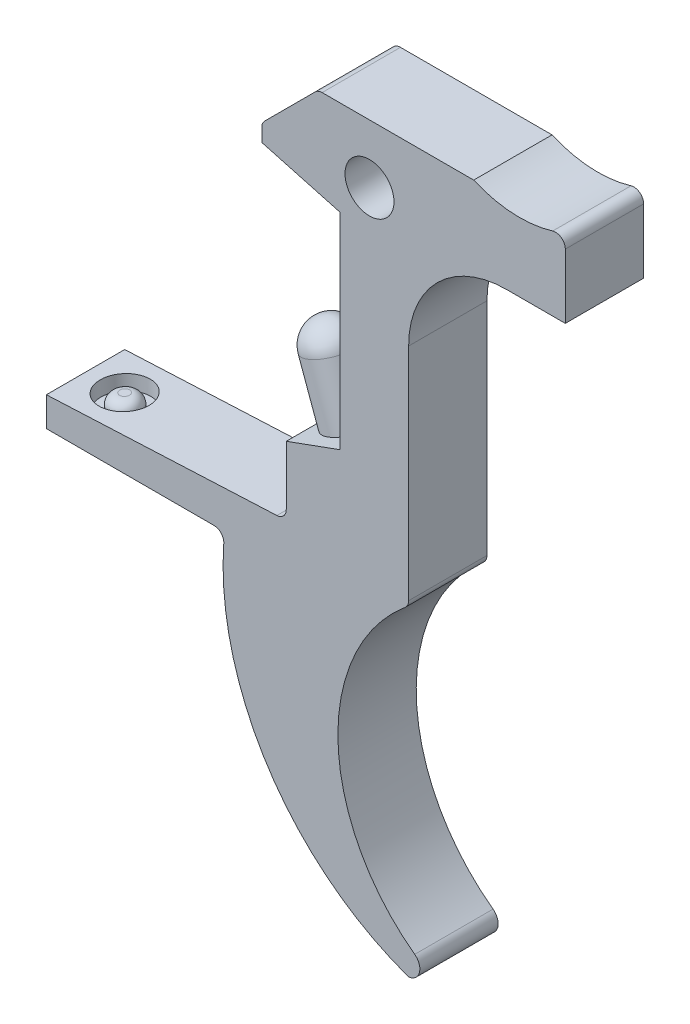
ISO-10303-21;
HEADER;
FILE_DESCRIPTION(('STEP AP214'),'2;1');
FILE_NAME('part.step','',(''),(''),'','','');
FILE_SCHEMA(('AUTOMOTIVE_DESIGN { 1 0 10303 214 1 1 1 1 }'));
ENDSEC;
DATA;
#1=APPLICATION_CONTEXT('core data for automotive mechanical design processes');
#2=APPLICATION_PROTOCOL_DEFINITION('international standard','automotive_design',2000,#1);
#3=PRODUCT_CONTEXT('',#1,'mechanical');
#4=PRODUCT('Part','Part','',(#3));
#5=PRODUCT_RELATED_PRODUCT_CATEGORY('part','',(#4));
#6=PRODUCT_DEFINITION_FORMATION('','',#4);
#7=PRODUCT_DEFINITION_CONTEXT('part definition',#1,'design');
#8=PRODUCT_DEFINITION('design','',#6,#7);
#9=PRODUCT_DEFINITION_SHAPE('','',#8);
#10=(LENGTH_UNIT() NAMED_UNIT(*) SI_UNIT(.MILLI.,.METRE.));
#11=(NAMED_UNIT(*) PLANE_ANGLE_UNIT() SI_UNIT($,.RADIAN.));
#12=(NAMED_UNIT(*) SI_UNIT($,.STERADIAN.) SOLID_ANGLE_UNIT());
#13=UNCERTAINTY_MEASURE_WITH_UNIT(LENGTH_MEASURE(1.E-05),#10,'distance_accuracy_value','');
#14=(GEOMETRIC_REPRESENTATION_CONTEXT(3) GLOBAL_UNCERTAINTY_ASSIGNED_CONTEXT((#13)) GLOBAL_UNIT_ASSIGNED_CONTEXT((#10,
#11,#12)) REPRESENTATION_CONTEXT('',''));
#15=CARTESIAN_POINT('',(0.,0.,0.));
#16=DIRECTION('',(0.,0.,1.));
#17=DIRECTION('',(1.,0.,0.));
#18=AXIS2_PLACEMENT_3D('',#15,#16,#17);
#19=CARTESIAN_POINT('',(4.00000000000001,0.,8.));
#20=DIRECTION('',(-1.,0.,0.));
#21=DIRECTION('',(0.,0.,1.));
#22=AXIS2_PLACEMENT_3D('',#19,#20,#21);
#23=PLANE('',#22);
#24=DIRECTION('',(0.,1.,0.));
#25=VECTOR('',#24,1.);
#26=CARTESIAN_POINT('',(4.00000000000001,0.,8.));
#27=LINE('',#26,#25);
#28=CARTESIAN_POINT('',(4.00000000000001,-34.5260871029206,8.));
#29=VERTEX_POINT('',#28);
#30=CARTESIAN_POINT('',(4.00000000000001,-12.,8.));
#31=VERTEX_POINT('',#30);
#32=EDGE_CURVE('E197',#29,#31,#27,.T.);
#33=ORIENTED_EDGE('',*,*,#32,.F.);
#34=DIRECTION('',(0.,0.,1.));
#35=VECTOR('',#34,1.);
#36=CARTESIAN_POINT('',(4.00000000000001,-34.5260871029206,0.));
#37=LINE('',#36,#35);
#38=CARTESIAN_POINT('',(4.00000000000001,-34.5260871029206,0.));
#39=VERTEX_POINT('',#38);
#40=EDGE_CURVE('E239',#29,#39,#37,.F.);
#41=ORIENTED_EDGE('',*,*,#40,.T.);
#42=DIRECTION('',(0.,1.,0.));
#43=VECTOR('',#42,1.);
#44=CARTESIAN_POINT('',(4.00000000000001,0.,0.));
#45=LINE('',#44,#43);
#46=CARTESIAN_POINT('',(4.00000000000001,-12.,0.));
#47=VERTEX_POINT('',#46);
#48=EDGE_CURVE('E222',#39,#47,#45,.T.);
#49=ORIENTED_EDGE('',*,*,#48,.T.);
#50=DIRECTION('',(0.,0.,-1.));
#51=VECTOR('',#50,1.);
#52=CARTESIAN_POINT('',(4.00000000000001,-12.,8.));
#53=LINE('',#52,#51);
#54=EDGE_CURVE('E215',#31,#47,#53,.T.);
#55=ORIENTED_EDGE('',*,*,#54,.F.);
#56=EDGE_LOOP('',(#33,#41,#49,#55));
#57=FACE_BOUND('',#56,.T.);
#58=ADVANCED_FACE('F35',(#57),#23,.F.);
#59=CARTESIAN_POINT('',(14.,-12.,8.));
#60=DIRECTION('',(0.,0.,-1.));
#61=DIRECTION('',(-1.,0.,0.));
#62=AXIS2_PLACEMENT_3D('',#59,#60,#61);
#63=CYLINDRICAL_SURFACE('',#62,10.);
#64=CARTESIAN_POINT('',(14.,-12.,0.));
#65=DIRECTION('',(0.,0.,1.));
#66=DIRECTION('',(1.,0.,0.));
#67=AXIS2_PLACEMENT_3D('',#64,#65,#66);
#68=CIRCLE('',#67,10.);
#69=CARTESIAN_POINT('',(14.,-2.,0.));
#70=VERTEX_POINT('',#69);
#71=EDGE_CURVE('E438',#47,#70,#68,.F.);
#72=ORIENTED_EDGE('',*,*,#71,.T.);
#73=DIRECTION('',(0.,0.,-1.));
#74=VECTOR('',#73,1.);
#75=CARTESIAN_POINT('',(14.,-2.,8.));
#76=LINE('',#75,#74);
#77=CARTESIAN_POINT('',(14.,-2.,8.));
#78=VERTEX_POINT('',#77);
#79=EDGE_CURVE('E217',#78,#70,#76,.T.);
#80=ORIENTED_EDGE('',*,*,#79,.F.);
#81=CARTESIAN_POINT('',(14.,-12.,8.));
#82=DIRECTION('',(0.,0.,1.));
#83=DIRECTION('',(1.,0.,0.));
#84=AXIS2_PLACEMENT_3D('',#81,#82,#83);
#85=CIRCLE('',#84,10.);
#86=EDGE_CURVE('E201',#31,#78,#85,.F.);
#87=ORIENTED_EDGE('',*,*,#86,.F.);
#88=ORIENTED_EDGE('',*,*,#54,.T.);
#89=EDGE_LOOP('',(#72,#80,#87,#88));
#90=FACE_BOUND('',#89,.T.);
#91=ADVANCED_FACE('F214',(#90),#63,.F.);
#92=CARTESIAN_POINT('',(0.,-2.,8.));
#93=DIRECTION('',(0.,1.,0.));
#94=DIRECTION('',(0.,0.,1.));
#95=AXIS2_PLACEMENT_3D('',#92,#93,#94);
#96=PLANE('',#95);
#97=CARTESIAN_POINT('',(16.7260465752364,-2.,4.));
#98=DIRECTION('',(0.,-1.,0.));
#99=DIRECTION('',(0.,0.,-1.));
#100=AXIS2_PLACEMENT_3D('',#97,#98,#99);
#101=CIRCLE('',#100,2.5);
#102=CARTESIAN_POINT('',(16.7260465752364,-2.,1.5));
#103=VERTEX_POINT('',#102);
#104=EDGE_CURVE('E508',#103,#103,#101,.T.);
#105=ORIENTED_EDGE('',*,*,#104,.F.);
#106=EDGE_LOOP('',(#105));
#107=FACE_BOUND('',#106,.T.);
#108=DIRECTION('',(1.,0.,0.));
#109=VECTOR('',#108,1.);
#110=CARTESIAN_POINT('',(0.,-2.,0.));
#111=LINE('',#110,#109);
#112=CARTESIAN_POINT('',(20.,-2.,0.));
#113=VERTEX_POINT('',#112);
#114=EDGE_CURVE('E433',#70,#113,#111,.T.);
#115=ORIENTED_EDGE('',*,*,#114,.T.);
#116=DIRECTION('',(0.,0.,-1.));
#117=VECTOR('',#116,1.);
#118=CARTESIAN_POINT('',(20.,-2.,8.));
#119=LINE('',#118,#117);
#120=CARTESIAN_POINT('',(20.,-2.,8.));
#121=VERTEX_POINT('',#120);
#122=EDGE_CURVE('E229',#121,#113,#119,.T.);
#123=ORIENTED_EDGE('',*,*,#122,.F.);
#124=DIRECTION('',(1.,0.,0.));
#125=VECTOR('',#124,1.);
#126=CARTESIAN_POINT('',(0.,-2.,8.));
#127=LINE('',#126,#125);
#128=EDGE_CURVE('E219',#78,#121,#127,.T.);
#129=ORIENTED_EDGE('',*,*,#128,.F.);
#130=ORIENTED_EDGE('',*,*,#79,.T.);
#131=EDGE_LOOP('',(#115,#123,#129,#130));
#132=FACE_BOUND('',#131,.T.);
#133=ADVANCED_FACE('F305',(#107,#132),#96,.F.);
#134=CARTESIAN_POINT('',(20.,0.,8.));
#135=DIRECTION('',(-1.,0.,0.));
#136=DIRECTION('',(0.,-1.,0.));
#137=AXIS2_PLACEMENT_3D('',#134,#135,#136);
#138=PLANE('',#137);
#139=DIRECTION('',(0.,1.,0.));
#140=VECTOR('',#139,1.);
#141=CARTESIAN_POINT('',(20.,0.,0.));
#142=LINE('',#141,#140);
#143=CARTESIAN_POINT('',(20.,4.570483540236,0.));
#144=VERTEX_POINT('',#143);
#145=EDGE_CURVE('E427',#113,#144,#142,.T.);
#146=ORIENTED_EDGE('',*,*,#145,.T.);
#147=DIRECTION('',(0.,0.,-1.));
#148=VECTOR('',#147,1.);
#149=CARTESIAN_POINT('',(20.,4.570483540236,8.));
#150=LINE('',#149,#148);
#151=CARTESIAN_POINT('',(20.,4.570483540236,8.));
#152=VERTEX_POINT('',#151);
#153=EDGE_CURVE('E268',#144,#152,#150,.F.);
#154=ORIENTED_EDGE('',*,*,#153,.T.);
#155=DIRECTION('',(0.,1.,0.));
#156=VECTOR('',#155,1.);
#157=CARTESIAN_POINT('',(20.,0.,8.));
#158=LINE('',#157,#156);
#159=EDGE_CURVE('E430',#121,#152,#158,.T.);
#160=ORIENTED_EDGE('',*,*,#159,.F.);
#161=ORIENTED_EDGE('',*,*,#122,.T.);
#162=EDGE_LOOP('',(#146,#154,#160,#161));
#163=FACE_BOUND('',#162,.T.);
#164=ADVANCED_FACE('F426',(#163),#138,.F.);
#165=CARTESIAN_POINT('',(15.3229478140334,16.7721662926521,8.));
#166=DIRECTION('',(0.,0.,-1.));
#167=DIRECTION('',(-1.,0.,0.));
#168=AXIS2_PLACEMENT_3D('',#165,#166,#167);
#169=CYLINDRICAL_SURFACE('',#168,11.7436954910627);
#170=CARTESIAN_POINT('',(15.3229478140334,16.7721662926521,8.));
#171=DIRECTION('',(0.,0.,1.));
#172=DIRECTION('',(1.,0.,0.));
#173=AXIS2_PLACEMENT_3D('',#170,#171,#172);
#174=CIRCLE('',#173,11.7436954910627);
#175=CARTESIAN_POINT('',(18.7114610759065,5.5279517064342,8.));
#176=VERTEX_POINT('',#175);
#177=CARTESIAN_POINT('',(10.6458956280668,6.,8.));
#178=VERTEX_POINT('',#177);
#179=EDGE_CURVE('E454',#176,#178,#174,.F.);
#180=ORIENTED_EDGE('',*,*,#179,.F.);
#181=DIRECTION('',(0.,0.,-1.));
#182=VECTOR('',#181,1.);
#183=CARTESIAN_POINT('',(18.7114610759065,5.5279517064342,8.));
#184=LINE('',#183,#182);
#185=CARTESIAN_POINT('',(18.7114610759065,5.5279517064342,0.));
#186=VERTEX_POINT('',#185);
#187=EDGE_CURVE('E263',#176,#186,#184,.T.);
#188=ORIENTED_EDGE('',*,*,#187,.T.);
#189=CARTESIAN_POINT('',(15.3229478140334,16.7721662926521,0.));
#190=DIRECTION('',(0.,0.,1.));
#191=DIRECTION('',(1.,0.,0.));
#192=AXIS2_PLACEMENT_3D('',#189,#190,#191);
#193=CIRCLE('',#192,11.7436954910627);
#194=CARTESIAN_POINT('',(10.6458956280668,6.,0.));
#195=VERTEX_POINT('',#194);
#196=EDGE_CURVE('E435',#186,#195,#193,.F.);
#197=ORIENTED_EDGE('',*,*,#196,.T.);
#198=DIRECTION('',(0.,0.,-1.));
#199=VECTOR('',#198,1.);
#200=CARTESIAN_POINT('',(10.6458956280668,6.,8.));
#201=LINE('',#200,#199);
#202=EDGE_CURVE('E418',#178,#195,#201,.T.);
#203=ORIENTED_EDGE('',*,*,#202,.F.);
#204=EDGE_LOOP('',(#180,#188,#197,#203));
#205=FACE_BOUND('',#204,.T.);
#206=ADVANCED_FACE('F492',(#205),#169,.F.);
#207=CARTESIAN_POINT('',(0.,6.,8.));
#208=DIRECTION('',(0.,-1.,0.));
#209=DIRECTION('',(1.,0.,0.));
#210=AXIS2_PLACEMENT_3D('',#207,#208,#209);
#211=PLANE('',#210);
#212=DIRECTION('',(-1.,0.,0.));
#213=VECTOR('',#212,1.);
#214=CARTESIAN_POINT('',(0.,6.,0.));
#215=LINE('',#214,#213);
#216=CARTESIAN_POINT('',(-4.83578643762692,6.,0.));
#217=VERTEX_POINT('',#216);
#218=EDGE_CURVE('E368',#195,#217,#215,.T.);
#219=ORIENTED_EDGE('',*,*,#218,.T.);
#220=DIRECTION('',(0.,0.,-1.));
#221=VECTOR('',#220,1.);
#222=CARTESIAN_POINT('',(-4.83578643762692,6.,8.));
#223=LINE('',#222,#221);
#224=CARTESIAN_POINT('',(-4.83578643762692,6.,8.));
#225=VERTEX_POINT('',#224);
#226=EDGE_CURVE('E58',#217,#225,#223,.F.);
#227=ORIENTED_EDGE('',*,*,#226,.T.);
#228=DIRECTION('',(-1.,0.,0.));
#229=VECTOR('',#228,1.);
#230=CARTESIAN_POINT('',(0.,6.,8.));
#231=LINE('',#230,#229);
#232=EDGE_CURVE('E448',#178,#225,#231,.T.);
#233=ORIENTED_EDGE('',*,*,#232,.F.);
#234=ORIENTED_EDGE('',*,*,#202,.T.);
#235=EDGE_LOOP('',(#219,#227,#233,#234));
#236=FACE_BOUND('',#235,.T.);
#237=ADVANCED_FACE('F442',(#236),#211,.F.);
#238=CARTESIAN_POINT('',(-5.62500000000002,5.625,8.));
#239=DIRECTION('',(-0.707106781186549,0.707106781186546,0.));
#240=DIRECTION('',(-0.707106781186546,-0.707106781186549,0.));
#241=AXIS2_PLACEMENT_3D('',#238,#239,#240);
#242=PLANE('',#241);
#243=DIRECTION('',(0.707106781186546,0.707106781186549,0.));
#244=VECTOR('',#243,1.);
#245=CARTESIAN_POINT('',(-5.62500000000002,5.625,8.));
#246=LINE('',#245,#244);
#247=CARTESIAN_POINT('',(-10.7071067811865,0.542893218813451,8.));
#248=VERTEX_POINT('',#247);
#249=CARTESIAN_POINT('',(-5.54289321881347,5.70710678118655,8.));
#250=VERTEX_POINT('',#249);
#251=EDGE_CURVE('E447',#248,#250,#246,.T.);
#252=ORIENTED_EDGE('',*,*,#251,.T.);
#253=DIRECTION('',(0.,0.,-1.));
#254=VECTOR('',#253,1.);
#255=CARTESIAN_POINT('',(-5.54289321881347,5.70710678118655,0.));
#256=LINE('',#255,#254);
#257=CARTESIAN_POINT('',(-5.54289321881347,5.70710678118655,0.));
#258=VERTEX_POINT('',#257);
#259=EDGE_CURVE('E274',#250,#258,#256,.T.);
#260=ORIENTED_EDGE('',*,*,#259,.T.);
#261=DIRECTION('',(0.707106781186546,0.707106781186549,0.));
#262=VECTOR('',#261,1.);
#263=CARTESIAN_POINT('',(-5.62500000000002,5.625,0.));
#264=LINE('',#263,#262);
#265=CARTESIAN_POINT('',(-10.7071067811865,0.542893218813451,0.));
#266=VERTEX_POINT('',#265);
#267=EDGE_CURVE('E364',#266,#258,#264,.T.);
#268=ORIENTED_EDGE('',*,*,#267,.F.);
#269=DIRECTION('',(0.,0.,-1.));
#270=VECTOR('',#269,1.);
#271=CARTESIAN_POINT('',(-10.7071067811865,0.542893218813452,8.));
#272=LINE('',#271,#270);
#273=EDGE_CURVE('E272',#266,#248,#272,.F.);
#274=ORIENTED_EDGE('',*,*,#273,.T.);
#275=EDGE_LOOP('',(#252,#260,#268,#274));
#276=FACE_BOUND('',#275,.T.);
#277=ADVANCED_FACE('F450',(#276),#242,.T.);
#278=CARTESIAN_POINT('',(-11.,0.,8.));
#279=DIRECTION('',(1.,0.,0.));
#280=DIRECTION('',(0.,1.,0.));
#281=AXIS2_PLACEMENT_3D('',#278,#279,#280);
#282=PLANE('',#281);
#283=DIRECTION('',(0.,-1.,0.));
#284=VECTOR('',#283,1.);
#285=CARTESIAN_POINT('',(-11.,0.,8.));
#286=LINE('',#285,#284);
#287=CARTESIAN_POINT('',(-11.,-0.164213562373096,8.));
#288=VERTEX_POINT('',#287);
#289=CARTESIAN_POINT('',(-11.,-1.49389068457317,8.));
#290=VERTEX_POINT('',#289);
#291=EDGE_CURVE('E356',#288,#290,#286,.T.);
#292=ORIENTED_EDGE('',*,*,#291,.F.);
#293=DIRECTION('',(0.,0.,-1.));
#294=VECTOR('',#293,1.);
#295=CARTESIAN_POINT('',(-11.,-0.164213562373096,0.));
#296=LINE('',#295,#294);
#297=CARTESIAN_POINT('',(-11.,-0.164213562373096,0.));
#298=VERTEX_POINT('',#297);
#299=EDGE_CURVE('E285',#288,#298,#296,.T.);
#300=ORIENTED_EDGE('',*,*,#299,.T.);
#301=DIRECTION('',(0.,-1.,0.));
#302=VECTOR('',#301,1.);
#303=CARTESIAN_POINT('',(-11.,0.,0.));
#304=LINE('',#303,#302);
#305=CARTESIAN_POINT('',(-11.,-1.49389068457317,0.));
#306=VERTEX_POINT('',#305);
#307=EDGE_CURVE('E354',#298,#306,#304,.T.);
#308=ORIENTED_EDGE('',*,*,#307,.T.);
#309=DIRECTION('',(0.,0.,-1.));
#310=VECTOR('',#309,1.);
#311=CARTESIAN_POINT('',(-11.,-1.49389068457317,8.));
#312=LINE('',#311,#310);
#313=EDGE_CURVE('E416',#290,#306,#312,.T.);
#314=ORIENTED_EDGE('',*,*,#313,.F.);
#315=EDGE_LOOP('',(#292,#300,#308,#314));
#316=FACE_BOUND('',#315,.T.);
#317=ADVANCED_FACE('F352',(#316),#282,.F.);
#318=CARTESIAN_POINT('',(-1.13906342071928,-4.18062551024851,8.));
#319=DIRECTION('',(0.262879567912574,0.964828654619098,0.));
#320=DIRECTION('',(-0.964828654619098,0.262879567912574,0.));
#321=AXIS2_PLACEMENT_3D('',#318,#319,#320);
#322=PLANE('',#321);
#323=DIRECTION('',(0.964828654619098,-0.262879567912574,0.));
#324=VECTOR('',#323,1.);
#325=CARTESIAN_POINT('',(-1.13906342071928,-4.18062551024851,0.));
#326=LINE('',#325,#324);
#327=CARTESIAN_POINT('',(-3.,-3.67359019207883,0.));
#328=VERTEX_POINT('',#327);
#329=EDGE_CURVE('E363',#306,#328,#326,.T.);
#330=ORIENTED_EDGE('',*,*,#329,.T.);
#331=DIRECTION('',(0.,0.,-1.));
#332=VECTOR('',#331,1.);
#333=CARTESIAN_POINT('',(-3.,-3.67359019207883,8.));
#334=LINE('',#333,#332);
#335=CARTESIAN_POINT('',(-3.,-3.67359019207883,8.));
#336=VERTEX_POINT('',#335);
#337=EDGE_CURVE('E413',#336,#328,#334,.T.);
#338=ORIENTED_EDGE('',*,*,#337,.F.);
#339=DIRECTION('',(0.964828654619098,-0.262879567912574,0.));
#340=VECTOR('',#339,1.);
#341=CARTESIAN_POINT('',(-1.13906342071928,-4.18062551024851,8.));
#342=LINE('',#341,#340);
#343=EDGE_CURVE('E452',#290,#336,#342,.T.);
#344=ORIENTED_EDGE('',*,*,#343,.F.);
#345=ORIENTED_EDGE('',*,*,#313,.T.);
#346=EDGE_LOOP('',(#330,#338,#344,#345));
#347=FACE_BOUND('',#346,.T.);
#348=ADVANCED_FACE('F564',(#347),#322,.F.);
#349=CARTESIAN_POINT('',(-3.,0.,8.));
#350=DIRECTION('',(1.,0.,0.));
#351=DIRECTION('',(0.,1.,0.));
#352=AXIS2_PLACEMENT_3D('',#349,#350,#351);
#353=PLANE('',#352);
#354=CARTESIAN_POINT('',(-2.99999999999999,-9.67359019207883,4.));
#355=DIRECTION('',(1.,0.,0.));
#356=DIRECTION('',(0.,1.,0.));
#357=AXIS2_PLACEMENT_3D('',#354,#355,#356);
#358=CIRCLE('',#357,2.5);
#359=CARTESIAN_POINT('',(-3.,-7.17359019207883,4.));
#360=VERTEX_POINT('',#359);
#361=EDGE_CURVE('E254',#360,#360,#358,.F.);
#362=ORIENTED_EDGE('',*,*,#361,.F.);
#363=EDGE_LOOP('',(#362));
#364=FACE_BOUND('',#363,.T.);
#365=DIRECTION('',(0.,-1.,0.));
#366=VECTOR('',#365,1.);
#367=CARTESIAN_POINT('',(-3.,0.,0.));
#368=LINE('',#367,#366);
#369=CARTESIAN_POINT('',(-2.99999999999999,-24.6735901920788,0.));
#370=VERTEX_POINT('',#369);
#371=EDGE_CURVE('E366',#328,#370,#368,.T.);
#372=ORIENTED_EDGE('',*,*,#371,.T.);
#373=DIRECTION('',(0.,0.,-1.));
#374=VECTOR('',#373,1.);
#375=CARTESIAN_POINT('',(-2.99999999999999,-24.6735901920788,8.));
#376=LINE('',#375,#374);
#377=CARTESIAN_POINT('',(-2.99999999999999,-24.6735901920788,8.));
#378=VERTEX_POINT('',#377);
#379=EDGE_CURVE('E410',#378,#370,#376,.T.);
#380=ORIENTED_EDGE('',*,*,#379,.F.);
#381=DIRECTION('',(0.,-1.,0.));
#382=VECTOR('',#381,1.);
#383=CARTESIAN_POINT('',(-3.,0.,8.));
#384=LINE('',#383,#382);
#385=EDGE_CURVE('E459',#336,#378,#384,.T.);
#386=ORIENTED_EDGE('',*,*,#385,.F.);
#387=ORIENTED_EDGE('',*,*,#337,.T.);
#388=EDGE_LOOP('',(#372,#380,#386,#387));
#389=FACE_BOUND('',#388,.T.);
#390=ADVANCED_FACE('F559',(#364,#389),#353,.F.);
#391=CARTESIAN_POINT('',(7.57900569565416,-20.8231470107282,8.));
#392=DIRECTION('',(0.342020143325663,-0.939692620785911,0.));
#393=DIRECTION('',(0.939692620785911,0.342020143325663,0.));
#394=AXIS2_PLACEMENT_3D('',#391,#392,#393);
#395=PLANE('',#394);
#396=CARTESIAN_POINT('',(-5.75,-25.6745083363109,4.));
#397=DIRECTION('',(0.342020143325663,-0.939692620785911,0.));
#398=DIRECTION('',(0.939692620785911,0.342020143325663,0.));
#399=AXIS2_PLACEMENT_3D('',#396,#397,#398);
#400=CIRCLE('',#399,2.5);
#401=CARTESIAN_POINT('',(-3.40076844803522,-24.8194579779967,4.));
#402=VERTEX_POINT('',#401);
#403=EDGE_CURVE('E257',#402,#402,#400,.F.);
#404=ORIENTED_EDGE('',*,*,#403,.F.);
#405=EDGE_LOOP('',(#404));
#406=FACE_BOUND('',#405,.T.);
#407=DIRECTION('',(-0.939692620785911,-0.342020143325663,0.));
#408=VECTOR('',#407,1.);
#409=CARTESIAN_POINT('',(7.57900569565416,-20.8231470107282,0.));
#410=LINE('',#409,#408);
#411=CARTESIAN_POINT('',(-8.49999999999999,-26.6754264805429,0.));
#412=VERTEX_POINT('',#411);
#413=EDGE_CURVE('E373',#370,#412,#410,.T.);
#414=ORIENTED_EDGE('',*,*,#413,.T.);
#415=DIRECTION('',(0.,0.,-1.));
#416=VECTOR('',#415,1.);
#417=CARTESIAN_POINT('',(-8.49999999999999,-26.6754264805429,8.));
#418=LINE('',#417,#416);
#419=CARTESIAN_POINT('',(-8.49999999999999,-26.6754264805429,8.));
#420=VERTEX_POINT('',#419);
#421=EDGE_CURVE('E407',#420,#412,#418,.T.);
#422=ORIENTED_EDGE('',*,*,#421,.F.);
#423=DIRECTION('',(-0.939692620785911,-0.342020143325663,0.));
#424=VECTOR('',#423,1.);
#425=CARTESIAN_POINT('',(7.57900569565416,-20.8231470107282,8.));
#426=LINE('',#425,#424);
#427=EDGE_CURVE('E461',#378,#420,#426,.T.);
#428=ORIENTED_EDGE('',*,*,#427,.F.);
#429=ORIENTED_EDGE('',*,*,#379,.T.);
#430=EDGE_LOOP('',(#414,#422,#428,#429));
#431=FACE_BOUND('',#430,.T.);
#432=ADVANCED_FACE('F556',(#406,#431),#395,.F.);
#433=CARTESIAN_POINT('',(-8.49999999999999,0.,8.));
#434=DIRECTION('',(1.,0.,0.));
#435=DIRECTION('',(0.,0.,-1.));
#436=AXIS2_PLACEMENT_3D('',#433,#434,#435);
#437=PLANE('',#436);
#438=DIRECTION('',(0.,-1.,0.));
#439=VECTOR('',#438,1.);
#440=CARTESIAN_POINT('',(-8.49999999999999,0.,0.));
#441=LINE('',#440,#439);
#442=CARTESIAN_POINT('',(-8.49999999999999,-32.7206405953108,0.));
#443=VERTEX_POINT('',#442);
#444=EDGE_CURVE('E375',#412,#443,#441,.T.);
#445=ORIENTED_EDGE('',*,*,#444,.T.);
#446=DIRECTION('',(0.,0.,-1.));
#447=VECTOR('',#446,1.);
#448=CARTESIAN_POINT('',(-8.49999999999999,-32.7206405953108,8.));
#449=LINE('',#448,#447);
#450=CARTESIAN_POINT('',(-8.49999999999999,-32.7206405953108,8.));
#451=VERTEX_POINT('',#450);
#452=EDGE_CURVE('E227',#443,#451,#449,.F.);
#453=ORIENTED_EDGE('',*,*,#452,.T.);
#454=DIRECTION('',(0.,-1.,0.));
#455=VECTOR('',#454,1.);
#456=CARTESIAN_POINT('',(-8.49999999999999,0.,8.));
#457=LINE('',#456,#455);
#458=EDGE_CURVE('E463',#420,#451,#457,.T.);
#459=ORIENTED_EDGE('',*,*,#458,.F.);
#460=ORIENTED_EDGE('',*,*,#421,.T.);
#461=EDGE_LOOP('',(#445,#453,#459,#460));
#462=FACE_BOUND('',#461,.T.);
#463=ADVANCED_FACE('F541',(#462),#437,.F.);
#464=CARTESIAN_POINT('',(1.53715394339735,-33.2108600482932,8.));
#465=DIRECTION('',(-0.0462351797409927,0.998930582249997,0.));
#466=DIRECTION('',(-0.998930582249997,-0.0462351797409927,0.));
#467=AXIS2_PLACEMENT_3D('',#464,#465,#466);
#468=PLANE('',#467);
#469=CARTESIAN_POINT('',(-29.004277671,-34.6244603577945,4.));
#470=DIRECTION('',(-0.0462351797409927,0.998930582249997,0.));
#471=DIRECTION('',(-0.998930582249997,-0.0462351797409927,0.));
#472=AXIS2_PLACEMENT_3D('',#469,#470,#471);
#473=CIRCLE('',#472,2.5);
#474=CARTESIAN_POINT('',(-31.501604126625,-34.740048307147,4.));
#475=VERTEX_POINT('',#474);
#476=EDGE_CURVE('E515',#475,#475,#473,.T.);
#477=ORIENTED_EDGE('',*,*,#476,.F.);
#478=EDGE_LOOP('',(#477));
#479=FACE_BOUND('',#478,.T.);
#480=DIRECTION('',(0.998930582249997,0.0462351797409927,0.));
#481=VECTOR('',#480,1.);
#482=CARTESIAN_POINT('',(1.53715394339735,-33.2108600482932,8.));
#483=LINE('',#482,#481);
#484=CARTESIAN_POINT('',(-33.,-34.8094010767585,8.));
#485=VERTEX_POINT('',#484);
#486=CARTESIAN_POINT('',(-9.453764820259,-33.7195711775608,8.));
#487=VERTEX_POINT('',#486);
#488=EDGE_CURVE('E466',#485,#487,#483,.T.);
#489=ORIENTED_EDGE('',*,*,#488,.T.);
#490=DIRECTION('',(0.,0.,-1.));
#491=VECTOR('',#490,1.);
#492=CARTESIAN_POINT('',(-9.453764820259,-33.7195711775608,8.));
#493=LINE('',#492,#491);
#494=CARTESIAN_POINT('',(-9.453764820259,-33.7195711775608,0.));
#495=VERTEX_POINT('',#494);
#496=EDGE_CURVE('E224',#487,#495,#493,.T.);
#497=ORIENTED_EDGE('',*,*,#496,.T.);
#498=DIRECTION('',(0.998930582249997,0.0462351797409927,0.));
#499=VECTOR('',#498,1.);
#500=CARTESIAN_POINT('',(1.53715394339735,-33.2108600482932,0.));
#501=LINE('',#500,#499);
#502=CARTESIAN_POINT('',(-33.,-34.8094010767585,0.));
#503=VERTEX_POINT('',#502);
#504=EDGE_CURVE('E378',#503,#495,#501,.T.);
#505=ORIENTED_EDGE('',*,*,#504,.F.);
#506=DIRECTION('',(0.,0.,-1.));
#507=VECTOR('',#506,1.);
#508=CARTESIAN_POINT('',(-33.,-34.8094010767585,8.));
#509=LINE('',#508,#507);
#510=EDGE_CURVE('E405',#485,#503,#509,.T.);
#511=ORIENTED_EDGE('',*,*,#510,.F.);
#512=EDGE_LOOP('',(#489,#497,#505,#511));
#513=FACE_BOUND('',#512,.T.);
#514=ADVANCED_FACE('F537',(#479,#513),#468,.T.);
#515=CARTESIAN_POINT('',(-33.,0.,8.));
#516=DIRECTION('',(-1.,0.,0.));
#517=DIRECTION('',(0.,0.,1.));
#518=AXIS2_PLACEMENT_3D('',#515,#516,#517);
#519=PLANE('',#518);
#520=DIRECTION('',(0.,1.,0.));
#521=VECTOR('',#520,1.);
#522=CARTESIAN_POINT('',(-33.,0.,0.));
#523=LINE('',#522,#521);
#524=CARTESIAN_POINT('',(-33.,-37.8094010767585,0.));
#525=VERTEX_POINT('',#524);
#526=EDGE_CURVE('E381',#525,#503,#523,.T.);
#527=ORIENTED_EDGE('',*,*,#526,.F.);
#528=DIRECTION('',(0.,0.,-1.));
#529=VECTOR('',#528,1.);
#530=CARTESIAN_POINT('',(-33.,-37.8094010767585,8.));
#531=LINE('',#530,#529);
#532=CARTESIAN_POINT('',(-33.,-37.8094010767585,8.));
#533=VERTEX_POINT('',#532);
#534=EDGE_CURVE('E403',#533,#525,#531,.T.);
#535=ORIENTED_EDGE('',*,*,#534,.F.);
#536=DIRECTION('',(0.,1.,0.));
#537=VECTOR('',#536,1.);
#538=CARTESIAN_POINT('',(-33.,0.,8.));
#539=LINE('',#538,#537);
#540=EDGE_CURVE('E469',#533,#485,#539,.T.);
#541=ORIENTED_EDGE('',*,*,#540,.T.);
#542=ORIENTED_EDGE('',*,*,#510,.T.);
#543=EDGE_LOOP('',(#527,#535,#541,#542));
#544=FACE_BOUND('',#543,.T.);
#545=ADVANCED_FACE('F540',(#544),#519,.T.);
#546=CARTESIAN_POINT('',(0.,-37.8094010767585,8.));
#547=DIRECTION('',(0.,1.,0.));
#548=DIRECTION('',(-1.,0.,0.));
#549=AXIS2_PLACEMENT_3D('',#546,#547,#548);
#550=PLANE('',#549);
#551=DIRECTION('',(1.,0.,0.));
#552=VECTOR('',#551,1.);
#553=CARTESIAN_POINT('',(0.,-37.8094010767585,0.));
#554=LINE('',#553,#552);
#555=CARTESIAN_POINT('',(-15.8788880811224,-37.8094010767585,0.));
#556=VERTEX_POINT('',#555);
#557=EDGE_CURVE('E384',#525,#556,#554,.T.);
#558=ORIENTED_EDGE('',*,*,#557,.T.);
#559=DIRECTION('',(0.,0.,-1.));
#560=VECTOR('',#559,1.);
#561=CARTESIAN_POINT('',(-15.8788880811224,-37.8094010767585,8.));
#562=LINE('',#561,#560);
#563=CARTESIAN_POINT('',(-15.8788880811224,-37.8094010767585,8.));
#564=VERTEX_POINT('',#563);
#565=EDGE_CURVE('E237',#556,#564,#562,.F.);
#566=ORIENTED_EDGE('',*,*,#565,.T.);
#567=DIRECTION('',(1.,0.,0.));
#568=VECTOR('',#567,1.);
#569=CARTESIAN_POINT('',(0.,-37.8094010767585,8.));
#570=LINE('',#569,#568);
#571=EDGE_CURVE('E472',#533,#564,#570,.T.);
#572=ORIENTED_EDGE('',*,*,#571,.F.);
#573=ORIENTED_EDGE('',*,*,#534,.T.);
#574=EDGE_LOOP('',(#558,#566,#572,#573));
#575=FACE_BOUND('',#574,.T.);
#576=ADVANCED_FACE('F700',(#575),#550,.F.);
#577=CARTESIAN_POINT('',(13.6307986556612,-40.8972903222414,8.));
#578=DIRECTION('',(0.,0.,-1.));
#579=DIRECTION('',(-1.,0.,0.));
#580=AXIS2_PLACEMENT_3D('',#577,#578,#579);
#581=CYLINDRICAL_SURFACE('',#580,28.5834564039516);
#582=CARTESIAN_POINT('',(13.6307986556612,-40.8972903222414,8.));
#583=DIRECTION('',(0.,0.,1.));
#584=DIRECTION('',(1.,0.,0.));
#585=AXIS2_PLACEMENT_3D('',#582,#583,#584);
#586=CIRCLE('',#585,28.5834564039516);
#587=CARTESIAN_POINT('',(4.00000041600159,-67.8094010767618,8.));
#588=VERTEX_POINT('',#587);
#589=CARTESIAN_POINT('',(-14.8813816933008,-38.8799773210274,8.));
#590=VERTEX_POINT('',#589);
#591=EDGE_CURVE('E475',#588,#590,#586,.F.);
#592=ORIENTED_EDGE('',*,*,#591,.T.);
#593=DIRECTION('',(0.,0.,-1.));
#594=VECTOR('',#593,1.);
#595=CARTESIAN_POINT('',(-14.8813816933008,-38.8799773210274,8.));
#596=LINE('',#595,#594);
#597=CARTESIAN_POINT('',(-14.8813816933008,-38.8799773210274,0.));
#598=VERTEX_POINT('',#597);
#599=EDGE_CURVE('E234',#590,#598,#596,.T.);
#600=ORIENTED_EDGE('',*,*,#599,.T.);
#601=CARTESIAN_POINT('',(13.6307986556612,-40.8972903222414,0.));
#602=DIRECTION('',(0.,0.,1.));
#603=DIRECTION('',(1.,0.,0.));
#604=AXIS2_PLACEMENT_3D('',#601,#602,#603);
#605=CIRCLE('',#604,28.5834564039516);
#606=CARTESIAN_POINT('',(4.00000041600159,-67.8094010767618,0.));
#607=VERTEX_POINT('',#606);
#608=EDGE_CURVE('E387',#607,#598,#605,.F.);
#609=ORIENTED_EDGE('',*,*,#608,.F.);
#610=DIRECTION('',(0.,0.,-1.));
#611=VECTOR('',#610,1.);
#612=CARTESIAN_POINT('',(4.00000041600159,-67.8094010767618,8.));
#613=LINE('',#612,#611);
#614=EDGE_CURVE('E400',#588,#607,#613,.T.);
#615=ORIENTED_EDGE('',*,*,#614,.F.);
#616=EDGE_LOOP('',(#592,#600,#609,#615));
#617=FACE_BOUND('',#616,.T.);
#618=ADVANCED_FACE('F696',(#617),#581,.T.);
#619=CARTESIAN_POINT('',(3.86015002362675,-66.53181214906,8.));
#620=DIRECTION('',(0.,0.,-1.));
#621=DIRECTION('',(-1.,0.,0.));
#622=AXIS2_PLACEMENT_3D('',#619,#620,#621);
#623=CYLINDRICAL_SURFACE('',#622,1.28522044818524);
#624=CARTESIAN_POINT('',(3.86015002362675,-66.53181214906,0.));
#625=DIRECTION('',(0.,0.,1.));
#626=DIRECTION('',(1.,0.,0.));
#627=AXIS2_PLACEMENT_3D('',#624,#625,#626);
#628=CIRCLE('',#627,1.28522044818524);
#629=CARTESIAN_POINT('',(4.62025493107297,-65.4954569348069,0.));
#630=VERTEX_POINT('',#629);
#631=EDGE_CURVE('E390',#607,#630,#628,.T.);
#632=ORIENTED_EDGE('',*,*,#631,.T.);
#633=DIRECTION('',(0.,0.,-1.));
#634=VECTOR('',#633,1.);
#635=CARTESIAN_POINT('',(4.62025493107297,-65.4954569348069,8.));
#636=LINE('',#635,#634);
#637=CARTESIAN_POINT('',(4.62025493107297,-65.4954569348069,8.));
#638=VERTEX_POINT('',#637);
#639=EDGE_CURVE('E397',#638,#630,#636,.T.);
#640=ORIENTED_EDGE('',*,*,#639,.F.);
#641=CARTESIAN_POINT('',(3.86015002362675,-66.53181214906,8.));
#642=DIRECTION('',(0.,0.,1.));
#643=DIRECTION('',(1.,0.,0.));
#644=AXIS2_PLACEMENT_3D('',#641,#642,#643);
#645=CIRCLE('',#644,1.28522044818524);
#646=EDGE_CURVE('E478',#588,#638,#645,.T.);
#647=ORIENTED_EDGE('',*,*,#646,.F.);
#648=ORIENTED_EDGE('',*,*,#614,.T.);
#649=EDGE_LOOP('',(#632,#640,#647,#648));
#650=FACE_BOUND('',#649,.T.);
#651=ADVANCED_FACE('F692',(#650),#623,.T.);
#652=CARTESIAN_POINT('',(15.977608048034,-50.0104205831516,8.));
#653=DIRECTION('',(0.,0.,-1.));
#654=DIRECTION('',(-1.,0.,0.));
#655=AXIS2_PLACEMENT_3D('',#652,#653,#654);
#656=CYLINDRICAL_SURFACE('',#655,19.2035366699843);
#657=CARTESIAN_POINT('',(15.977608048034,-50.0104205831516,0.));
#658=DIRECTION('',(0.,0.,1.));
#659=DIRECTION('',(1.,0.,0.));
#660=AXIS2_PLACEMENT_3D('',#657,#658,#659);
#661=CIRCLE('',#660,19.2035366699843);
#662=CARTESIAN_POINT('',(3.64234338076632,-35.2925040789759,0.));
#663=VERTEX_POINT('',#662);
#664=EDGE_CURVE('E393',#663,#630,#661,.T.);
#665=ORIENTED_EDGE('',*,*,#664,.F.);
#666=DIRECTION('',(0.,0.,-1.));
#667=VECTOR('',#666,1.);
#668=CARTESIAN_POINT('',(3.64234338076632,-35.2925040789759,8.));
#669=LINE('',#668,#667);
#670=CARTESIAN_POINT('',(3.64234338076632,-35.2925040789759,8.));
#671=VERTEX_POINT('',#670);
#672=EDGE_CURVE('E243',#663,#671,#669,.F.);
#673=ORIENTED_EDGE('',*,*,#672,.T.);
#674=CARTESIAN_POINT('',(15.977608048034,-50.0104205831516,8.));
#675=DIRECTION('',(0.,0.,1.));
#676=DIRECTION('',(1.,0.,0.));
#677=AXIS2_PLACEMENT_3D('',#674,#675,#676);
#678=CIRCLE('',#677,19.2035366699843);
#679=EDGE_CURVE('E481',#671,#638,#678,.T.);
#680=ORIENTED_EDGE('',*,*,#679,.T.);
#681=ORIENTED_EDGE('',*,*,#639,.T.);
#682=EDGE_LOOP('',(#665,#673,#680,#681));
#683=FACE_BOUND('',#682,.T.);
#684=ADVANCED_FACE('F688',(#683),#656,.F.);
#685=CARTESIAN_POINT('',(0.,0.,8.));
#686=DIRECTION('',(0.,0.,-1.));
#687=DIRECTION('',(-1.,0.,0.));
#688=AXIS2_PLACEMENT_3D('',#685,#686,#687);
#689=CYLINDRICAL_SURFACE('',#688,2.5);
#690=CARTESIAN_POINT('',(0.,0.,8.));
#691=DIRECTION('',(0.,0.,1.));
#692=DIRECTION('',(1.,0.,0.));
#693=AXIS2_PLACEMENT_3D('',#690,#691,#692);
#694=CIRCLE('',#693,2.5);
#695=CARTESIAN_POINT('',(2.5,0.,8.));
#696=VERTEX_POINT('',#695);
#697=EDGE_CURVE('E401',#696,#696,#694,.T.);
#698=ORIENTED_EDGE('',*,*,#697,.T.);
#699=EDGE_LOOP('',(#698));
#700=FACE_BOUND('',#699,.T.);
#701=CARTESIAN_POINT('',(0.,0.,0.));
#702=DIRECTION('',(0.,0.,1.));
#703=DIRECTION('',(1.,0.,0.));
#704=AXIS2_PLACEMENT_3D('',#701,#702,#703);
#705=CIRCLE('',#704,2.5);
#706=CARTESIAN_POINT('',(2.5,0.,0.));
#707=VERTEX_POINT('',#706);
#708=EDGE_CURVE('E210',#707,#707,#705,.T.);
#709=ORIENTED_EDGE('',*,*,#708,.F.);
#710=EDGE_LOOP('',(#709));
#711=FACE_BOUND('',#710,.T.);
#712=ADVANCED_FACE('F594',(#700,#711),#689,.F.);
#713=CARTESIAN_POINT('',(0.,0.,8.));
#714=DIRECTION('',(0.,0.,1.));
#715=DIRECTION('',(1.,0.,0.));
#716=AXIS2_PLACEMENT_3D('',#713,#714,#715);
#717=PLANE('',#716);
#718=ORIENTED_EDGE('',*,*,#232,.T.);
#719=CARTESIAN_POINT('',(-4.83578643762692,5.,8.));
#720=DIRECTION('',(0.,0.,1.));
#721=DIRECTION('',(1.,0.,0.));
#722=AXIS2_PLACEMENT_3D('',#719,#720,#721);
#723=CIRCLE('',#722,1.);
#724=EDGE_CURVE('E283',#225,#250,#723,.T.);
#725=ORIENTED_EDGE('',*,*,#724,.T.);
#726=ORIENTED_EDGE('',*,*,#251,.F.);
#727=CARTESIAN_POINT('',(-9.99999999999999,-0.164213562373095,8.));
#728=DIRECTION('',(0.,0.,1.));
#729=DIRECTION('',(1.,0.,0.));
#730=AXIS2_PLACEMENT_3D('',#727,#728,#729);
#731=CIRCLE('',#730,1.);
#732=EDGE_CURVE('E50',#248,#288,#731,.T.);
#733=ORIENTED_EDGE('',*,*,#732,.T.);
#734=ORIENTED_EDGE('',*,*,#291,.T.);
#735=ORIENTED_EDGE('',*,*,#343,.T.);
#736=ORIENTED_EDGE('',*,*,#385,.T.);
#737=ORIENTED_EDGE('',*,*,#427,.T.);
#738=ORIENTED_EDGE('',*,*,#458,.T.);
#739=CARTESIAN_POINT('',(-9.49999999999999,-32.7206405953108,8.));
#740=DIRECTION('',(0.,0.,1.));
#741=DIRECTION('',(1.,0.,0.));
#742=AXIS2_PLACEMENT_3D('',#739,#740,#741);
#743=CIRCLE('',#742,1.);
#744=EDGE_CURVE('E248',#451,#487,#743,.F.);
#745=ORIENTED_EDGE('',*,*,#744,.T.);
#746=ORIENTED_EDGE('',*,*,#488,.F.);
#747=ORIENTED_EDGE('',*,*,#540,.F.);
#748=ORIENTED_EDGE('',*,*,#571,.T.);
#749=CARTESIAN_POINT('',(-15.8788880811224,-38.8094010767585,8.));
#750=DIRECTION('',(0.,0.,1.));
#751=DIRECTION('',(1.,0.,0.));
#752=AXIS2_PLACEMENT_3D('',#749,#750,#751);
#753=CIRCLE('',#752,1.);
#754=EDGE_CURVE('E252',#564,#590,#753,.F.);
#755=ORIENTED_EDGE('',*,*,#754,.T.);
#756=ORIENTED_EDGE('',*,*,#591,.F.);
#757=ORIENTED_EDGE('',*,*,#646,.T.);
#758=ORIENTED_EDGE('',*,*,#679,.F.);
#759=CARTESIAN_POINT('',(3.00000000000001,-34.5260871029206,8.));
#760=DIRECTION('',(0.,0.,1.));
#761=DIRECTION('',(1.,0.,0.));
#762=AXIS2_PLACEMENT_3D('',#759,#760,#761);
#763=CIRCLE('',#762,1.);
#764=EDGE_CURVE('E205',#671,#29,#763,.T.);
#765=ORIENTED_EDGE('',*,*,#764,.T.);
#766=ORIENTED_EDGE('',*,*,#32,.T.);
#767=ORIENTED_EDGE('',*,*,#86,.T.);
#768=ORIENTED_EDGE('',*,*,#128,.T.);
#769=ORIENTED_EDGE('',*,*,#159,.T.);
#770=CARTESIAN_POINT('',(19.,4.570483540236,8.));
#771=DIRECTION('',(0.,0.,1.));
#772=DIRECTION('',(1.,0.,0.));
#773=AXIS2_PLACEMENT_3D('',#770,#771,#772);
#774=CIRCLE('',#773,1.);
#775=EDGE_CURVE('E270',#152,#176,#774,.T.);
#776=ORIENTED_EDGE('',*,*,#775,.T.);
#777=ORIENTED_EDGE('',*,*,#179,.T.);
#778=EDGE_LOOP('',(#718,#725,#726,#733,#734,#735,#736,#737,#738,#745,#746,#747,#748,#755,#756,
#757,#758,#765,#766,#767,#768,#769,#776,#777));
#779=FACE_BOUND('',#778,.T.);
#780=ORIENTED_EDGE('',*,*,#697,.F.);
#781=EDGE_LOOP('',(#780));
#782=FACE_BOUND('',#781,.T.);
#783=ADVANCED_FACE('F199',(#779,#782),#717,.T.);
#784=CARTESIAN_POINT('',(0.,0.,0.));
#785=DIRECTION('',(0.,0.,1.));
#786=DIRECTION('',(1.,0.,0.));
#787=AXIS2_PLACEMENT_3D('',#784,#785,#786);
#788=PLANE('',#787);
#789=ORIENTED_EDGE('',*,*,#267,.T.);
#790=CARTESIAN_POINT('',(-4.83578643762692,5.,0.));
#791=DIRECTION('',(0.,0.,1.));
#792=DIRECTION('',(1.,0.,0.));
#793=AXIS2_PLACEMENT_3D('',#790,#791,#792);
#794=CIRCLE('',#793,1.);
#795=EDGE_CURVE('E279',#258,#217,#794,.F.);
#796=ORIENTED_EDGE('',*,*,#795,.T.);
#797=ORIENTED_EDGE('',*,*,#218,.F.);
#798=ORIENTED_EDGE('',*,*,#196,.F.);
#799=CARTESIAN_POINT('',(19.,4.570483540236,0.));
#800=DIRECTION('',(0.,0.,1.));
#801=DIRECTION('',(1.,0.,0.));
#802=AXIS2_PLACEMENT_3D('',#799,#800,#801);
#803=CIRCLE('',#802,1.);
#804=EDGE_CURVE('E266',#186,#144,#803,.F.);
#805=ORIENTED_EDGE('',*,*,#804,.T.);
#806=ORIENTED_EDGE('',*,*,#145,.F.);
#807=ORIENTED_EDGE('',*,*,#114,.F.);
#808=ORIENTED_EDGE('',*,*,#71,.F.);
#809=ORIENTED_EDGE('',*,*,#48,.F.);
#810=CARTESIAN_POINT('',(3.00000000000001,-34.5260871029206,0.));
#811=DIRECTION('',(0.,0.,1.));
#812=DIRECTION('',(1.,0.,0.));
#813=AXIS2_PLACEMENT_3D('',#810,#811,#812);
#814=CIRCLE('',#813,1.);
#815=EDGE_CURVE('E241',#39,#663,#814,.F.);
#816=ORIENTED_EDGE('',*,*,#815,.T.);
#817=ORIENTED_EDGE('',*,*,#664,.T.);
#818=ORIENTED_EDGE('',*,*,#631,.F.);
#819=ORIENTED_EDGE('',*,*,#608,.T.);
#820=CARTESIAN_POINT('',(-15.8788880811224,-38.8094010767585,0.));
#821=DIRECTION('',(0.,0.,1.));
#822=DIRECTION('',(1.,0.,0.));
#823=AXIS2_PLACEMENT_3D('',#820,#821,#822);
#824=CIRCLE('',#823,1.);
#825=EDGE_CURVE('E250',#598,#556,#824,.T.);
#826=ORIENTED_EDGE('',*,*,#825,.T.);
#827=ORIENTED_EDGE('',*,*,#557,.F.);
#828=ORIENTED_EDGE('',*,*,#526,.T.);
#829=ORIENTED_EDGE('',*,*,#504,.T.);
#830=CARTESIAN_POINT('',(-9.49999999999999,-32.7206405953108,0.));
#831=DIRECTION('',(0.,0.,1.));
#832=DIRECTION('',(1.,0.,0.));
#833=AXIS2_PLACEMENT_3D('',#830,#831,#832);
#834=CIRCLE('',#833,1.);
#835=EDGE_CURVE('E246',#495,#443,#834,.T.);
#836=ORIENTED_EDGE('',*,*,#835,.T.);
#837=ORIENTED_EDGE('',*,*,#444,.F.);
#838=ORIENTED_EDGE('',*,*,#413,.F.);
#839=ORIENTED_EDGE('',*,*,#371,.F.);
#840=ORIENTED_EDGE('',*,*,#329,.F.);
#841=ORIENTED_EDGE('',*,*,#307,.F.);
#842=CARTESIAN_POINT('',(-9.99999999999999,-0.164213562373095,0.));
#843=DIRECTION('',(0.,0.,1.));
#844=DIRECTION('',(1.,0.,0.));
#845=AXIS2_PLACEMENT_3D('',#842,#843,#844);
#846=CIRCLE('',#845,1.);
#847=EDGE_CURVE('E277',#298,#266,#846,.F.);
#848=ORIENTED_EDGE('',*,*,#847,.T.);
#849=EDGE_LOOP('',(#789,#796,#797,#798,#805,#806,#807,#808,#809,#816,#817,#818,#819,#826,#827,
#828,#829,#836,#837,#838,#839,#840,#841,#848));
#850=FACE_BOUND('',#849,.T.);
#851=ORIENTED_EDGE('',*,*,#708,.T.);
#852=EDGE_LOOP('',(#851));
#853=FACE_BOUND('',#852,.T.);
#854=ADVANCED_FACE('F313',(#850,#853),#788,.F.);
#855=CARTESIAN_POINT('',(-9.49999999999999,-32.7206405953108,8.));
#856=DIRECTION('',(0.,0.,-1.));
#857=DIRECTION('',(-1.,0.,0.));
#858=AXIS2_PLACEMENT_3D('',#855,#856,#857);
#859=CYLINDRICAL_SURFACE('',#858,1.);
#860=ORIENTED_EDGE('',*,*,#744,.F.);
#861=ORIENTED_EDGE('',*,*,#452,.F.);
#862=ORIENTED_EDGE('',*,*,#835,.F.);
#863=ORIENTED_EDGE('',*,*,#496,.F.);
#864=EDGE_LOOP('',(#860,#861,#862,#863));
#865=FACE_BOUND('',#864,.T.);
#866=ADVANCED_FACE('F309',(#865),#859,.F.);
#867=CARTESIAN_POINT('',(-15.8788880811224,-38.8094010767585,8.));
#868=DIRECTION('',(0.,0.,-1.));
#869=DIRECTION('',(-1.,0.,0.));
#870=AXIS2_PLACEMENT_3D('',#867,#868,#869);
#871=CYLINDRICAL_SURFACE('',#870,1.);
#872=ORIENTED_EDGE('',*,*,#754,.F.);
#873=ORIENTED_EDGE('',*,*,#565,.F.);
#874=ORIENTED_EDGE('',*,*,#825,.F.);
#875=ORIENTED_EDGE('',*,*,#599,.F.);
#876=EDGE_LOOP('',(#872,#873,#874,#875));
#877=FACE_BOUND('',#876,.T.);
#878=ADVANCED_FACE('F312',(#877),#871,.F.);
#879=CARTESIAN_POINT('',(3.00000000000001,-34.5260871029206,8.));
#880=DIRECTION('',(0.,0.,-1.));
#881=DIRECTION('',(-1.,0.,0.));
#882=AXIS2_PLACEMENT_3D('',#879,#880,#881);
#883=CYLINDRICAL_SURFACE('',#882,1.);
#884=ORIENTED_EDGE('',*,*,#764,.F.);
#885=ORIENTED_EDGE('',*,*,#672,.F.);
#886=ORIENTED_EDGE('',*,*,#815,.F.);
#887=ORIENTED_EDGE('',*,*,#40,.F.);
#888=EDGE_LOOP('',(#884,#885,#886,#887));
#889=FACE_BOUND('',#888,.T.);
#890=ADVANCED_FACE('F317',(#889),#883,.T.);
#891=CARTESIAN_POINT('',(-2.99999999999999,-9.67359019207883,4.));
#892=DIRECTION('',(-1.,0.,0.));
#893=DIRECTION('',(0.,-1.,0.));
#894=AXIS2_PLACEMENT_3D('',#891,#892,#893);
#895=SPHERICAL_SURFACE('',#894,2.5);
#896=ORIENTED_EDGE('',*,*,#361,.T.);
#897=EDGE_LOOP('',(#896));
#898=FACE_BOUND('',#897,.T.);
#899=ADVANCED_FACE('F321',(#898),#895,.T.);
#900=CARTESIAN_POINT('',(-8.72557524693326,-17.4991825354735,4.));
#901=DIRECTION('',(0.342020143325663,-0.939692620785911,0.));
#902=DIRECTION('',(0.939692620785911,0.342020143325663,0.));
#903=AXIS2_PLACEMENT_3D('',#900,#901,#902);
#904=CYLINDRICAL_SURFACE('',#903,2.5);
#905=CARTESIAN_POINT('',(-7.8705248886191,-19.8484140874382,4.));
#906=DIRECTION('',(0.342020143325663,-0.939692620785911,0.));
#907=DIRECTION('',(0.939692620785911,0.342020143325663,0.));
#908=AXIS2_PLACEMENT_3D('',#905,#906,#907);
#909=CIRCLE('',#908,2.5);
#910=CARTESIAN_POINT('',(-5.52129333665433,-18.9933637291241,4.));
#911=VERTEX_POINT('',#910);
#912=EDGE_CURVE('E260',#911,#911,#909,.T.);
#913=ORIENTED_EDGE('',*,*,#912,.T.);
#914=EDGE_LOOP('',(#913));
#915=FACE_BOUND('',#914,.T.);
#916=ORIENTED_EDGE('',*,*,#403,.T.);
#917=EDGE_LOOP('',(#916));
#918=FACE_BOUND('',#917,.T.);
#919=ADVANCED_FACE('F325',(#915,#918),#904,.T.);
#920=CARTESIAN_POINT('',(-7.8705248886191,-19.8484140874382,4.));
#921=DIRECTION('',(-0.342020143325663,0.939692620785911,0.));
#922=DIRECTION('',(-0.939692620785911,-0.342020143325663,0.));
#923=AXIS2_PLACEMENT_3D('',#920,#921,#922);
#924=SPHERICAL_SURFACE('',#923,2.5);
#925=ORIENTED_EDGE('',*,*,#912,.F.);
#926=EDGE_LOOP('',(#925));
#927=FACE_BOUND('',#926,.T.);
#928=ADVANCED_FACE('F327',(#927),#924,.T.);
#929=CARTESIAN_POINT('',(19.,4.570483540236,8.));
#930=DIRECTION('',(0.,0.,-1.));
#931=DIRECTION('',(-1.,0.,0.));
#932=AXIS2_PLACEMENT_3D('',#929,#930,#931);
#933=CYLINDRICAL_SURFACE('',#932,1.);
#934=ORIENTED_EDGE('',*,*,#775,.F.);
#935=ORIENTED_EDGE('',*,*,#153,.F.);
#936=ORIENTED_EDGE('',*,*,#804,.F.);
#937=ORIENTED_EDGE('',*,*,#187,.F.);
#938=EDGE_LOOP('',(#934,#935,#936,#937));
#939=FACE_BOUND('',#938,.T.);
#940=ADVANCED_FACE('F330',(#939),#933,.T.);
#941=CARTESIAN_POINT('',(-4.83578643762692,5.,8.));
#942=DIRECTION('',(0.,0.,1.));
#943=DIRECTION('',(1.,0.,0.));
#944=AXIS2_PLACEMENT_3D('',#941,#942,#943);
#945=CYLINDRICAL_SURFACE('',#944,1.);
#946=ORIENTED_EDGE('',*,*,#724,.F.);
#947=ORIENTED_EDGE('',*,*,#226,.F.);
#948=ORIENTED_EDGE('',*,*,#795,.F.);
#949=ORIENTED_EDGE('',*,*,#259,.F.);
#950=EDGE_LOOP('',(#946,#947,#948,#949));
#951=FACE_BOUND('',#950,.T.);
#952=ADVANCED_FACE('F334',(#951),#945,.T.);
#953=CARTESIAN_POINT('',(-9.99999999999999,-0.164213562373095,8.));
#954=DIRECTION('',(0.,0.,1.));
#955=DIRECTION('',(1.,0.,0.));
#956=AXIS2_PLACEMENT_3D('',#953,#954,#955);
#957=CYLINDRICAL_SURFACE('',#956,1.);
#958=ORIENTED_EDGE('',*,*,#732,.F.);
#959=ORIENTED_EDGE('',*,*,#273,.F.);
#960=ORIENTED_EDGE('',*,*,#847,.F.);
#961=ORIENTED_EDGE('',*,*,#299,.F.);
#962=EDGE_LOOP('',(#958,#959,#960,#961));
#963=FACE_BOUND('',#962,.T.);
#964=ADVANCED_FACE('F337',(#963),#957,.T.);
#965=CARTESIAN_POINT('',(16.7260465752364,0.999999999999998,4.));
#966=DIRECTION('',(0.,-1.,0.));
#967=DIRECTION('',(0.,0.,-1.));
#968=AXIS2_PLACEMENT_3D('',#965,#966,#967);
#969=CYLINDRICAL_SURFACE('',#968,2.5);
#970=CARTESIAN_POINT('',(16.7260465752364,0.999999999999998,4.));
#971=DIRECTION('',(0.,-1.,0.));
#972=DIRECTION('',(0.,0.,-1.));
#973=AXIS2_PLACEMENT_3D('',#970,#971,#972);
#974=CIRCLE('',#973,2.5);
#975=CARTESIAN_POINT('',(16.7260465752364,0.999999999999998,1.5));
#976=VERTEX_POINT('',#975);
#977=EDGE_CURVE('E485',#976,#976,#974,.T.);
#978=ORIENTED_EDGE('',*,*,#977,.F.);
#979=EDGE_LOOP('',(#978));
#980=FACE_BOUND('',#979,.T.);
#981=ORIENTED_EDGE('',*,*,#104,.T.);
#982=EDGE_LOOP('',(#981));
#983=FACE_BOUND('',#982,.T.);
#984=ADVANCED_FACE('F340',(#980,#983),#969,.F.);
#985=CARTESIAN_POINT('',(16.7260465752364,0.999999999999998,4.));
#986=DIRECTION('',(0.,-1.,0.));
#987=DIRECTION('',(0.,0.,-1.));
#988=AXIS2_PLACEMENT_3D('',#985,#986,#987);
#989=PLANE('',#988);
#990=ORIENTED_EDGE('',*,*,#977,.T.);
#991=EDGE_LOOP('',(#990));
#992=FACE_BOUND('',#991,.T.);
#993=ADVANCED_FACE('F345',(#992),#989,.T.);
#994=CARTESIAN_POINT('',(-28.9349249013885,-36.1228562311695,4.));
#995=DIRECTION('',(-0.0462351797409927,0.998930582249997,0.));
#996=DIRECTION('',(-0.998930582249997,-0.0462351797409927,0.));
#997=AXIS2_PLACEMENT_3D('',#994,#995,#996);
#998=CYLINDRICAL_SURFACE('',#997,2.5);
#999=CARTESIAN_POINT('',(-28.9349249013885,-36.1228562311695,4.));
#1000=DIRECTION('',(-0.0462351797409927,0.998930582249997,0.));
#1001=DIRECTION('',(-0.998930582249997,-0.0462351797409927,0.));
#1002=AXIS2_PLACEMENT_3D('',#999,#1000,#1001);
#1003=CIRCLE('',#1002,2.5);
#1004=CARTESIAN_POINT('',(-31.4322513570135,-36.238444180522,4.));
#1005=VERTEX_POINT('',#1004);
#1006=EDGE_CURVE('E510',#1005,#1005,#1003,.T.);
#1007=ORIENTED_EDGE('',*,*,#1006,.F.);
#1008=EDGE_LOOP('',(#1007));
#1009=FACE_BOUND('',#1008,.T.);
#1010=ORIENTED_EDGE('',*,*,#476,.T.);
#1011=EDGE_LOOP('',(#1010));
#1012=FACE_BOUND('',#1011,.T.);
#1013=ADVANCED_FACE('F528',(#1009,#1012),#998,.F.);
#1014=CARTESIAN_POINT('',(-28.9349249013885,-36.1228562311695,4.));
#1015=DIRECTION('',(-0.0462351797409927,0.998930582249997,0.));
#1016=DIRECTION('',(-0.998930582249997,-0.0462351797409927,0.));
#1017=AXIS2_PLACEMENT_3D('',#1014,#1015,#1016);
#1018=PLANE('',#1017);
#1019=CARTESIAN_POINT('',(-28.9349249013885,-36.1228562311695,4.));
#1020=DIRECTION('',(-0.0462351797409927,0.998930582249997,0.));
#1021=DIRECTION('',(-0.998930582249997,-0.0462351797409927,0.));
#1022=AXIS2_PLACEMENT_3D('',#1019,#1020,#1021);
#1023=CIRCLE('',#1022,1.5);
#1024=CARTESIAN_POINT('',(-30.4333207747635,-36.192209000781,4.));
#1025=VERTEX_POINT('',#1024);
#1026=EDGE_CURVE('E519',#1025,#1025,#1023,.T.);
#1027=ORIENTED_EDGE('',*,*,#1026,.F.);
#1028=EDGE_LOOP('',(#1027));
#1029=FACE_BOUND('',#1028,.T.);
#1030=ORIENTED_EDGE('',*,*,#1006,.T.);
#1031=EDGE_LOOP('',(#1030));
#1032=FACE_BOUND('',#1031,.T.);
#1033=ADVANCED_FACE('F525',(#1029,#1032),#1018,.T.);
#1034=CARTESIAN_POINT('',(-29.004277671,-34.6244603577945,4.));
#1035=DIRECTION('',(0.0462351797409927,-0.998930582249997,0.));
#1036=DIRECTION('',(0.998930582249997,0.0462351797409927,0.));
#1037=AXIS2_PLACEMENT_3D('',#1034,#1035,#1036);
#1038=CYLINDRICAL_SURFACE('',#1037,1.5);
#1039=CARTESIAN_POINT('',(-28.958042491259,-35.6233909400445,4.));
#1040=DIRECTION('',(-0.0462351797409927,0.998930582249997,0.));
#1041=DIRECTION('',(-0.998930582249997,-0.0462351797409927,0.));
#1042=AXIS2_PLACEMENT_3D('',#1039,#1040,#1041);
#1043=CIRCLE('',#1042,1.5);
#1044=CARTESIAN_POINT('',(-30.456438364634,-35.692743709656,4.));
#1045=VERTEX_POINT('',#1044);
#1046=EDGE_CURVE('E11',#1045,#1045,#1043,.F.);
#1047=ORIENTED_EDGE('',*,*,#1046,.T.);
#1048=EDGE_LOOP('',(#1047));
#1049=FACE_BOUND('',#1048,.T.);
#1050=ORIENTED_EDGE('',*,*,#1026,.T.);
#1051=EDGE_LOOP('',(#1050));
#1052=FACE_BOUND('',#1051,.T.);
#1053=ADVANCED_FACE('F297',(#1049,#1052),#1038,.T.);
#1054=CARTESIAN_POINT('',(-29.004277671,-34.6244603577945,4.));
#1055=DIRECTION('',(-0.0462351797409927,0.998930582249997,0.));
#1056=DIRECTION('',(-0.998930582249997,-0.0462351797409927,0.));
#1057=AXIS2_PLACEMENT_3D('',#1054,#1055,#1056);
#1058=PLANE('',#1057);
#1059=CARTESIAN_POINT('',(-29.004277671,-34.6244603577945,4.));
#1060=DIRECTION('',(-0.0462351797409927,0.998930582249997,0.));
#1061=DIRECTION('',(-0.998930582249997,-0.0462351797409927,0.));
#1062=AXIS2_PLACEMENT_3D('',#1059,#1060,#1061);
#1063=CIRCLE('',#1062,0.500000000000003);
#1064=CARTESIAN_POINT('',(-29.503742962125,-34.647577947665,4.));
#1065=VERTEX_POINT('',#1064);
#1066=EDGE_CURVE('E43',#1065,#1065,#1063,.T.);
#1067=ORIENTED_EDGE('',*,*,#1066,.T.);
#1068=EDGE_LOOP('',(#1067));
#1069=FACE_BOUND('',#1068,.T.);
#1070=ADVANCED_FACE('F290',(#1069),#1058,.T.);
#1071=CARTESIAN_POINT('',(-28.958042491259,-35.6233909400445,4.));
#1072=DIRECTION('',(-0.0462351797409927,0.998930582249997,0.));
#1073=DIRECTION('',(-0.998930582249997,-0.0462351797409927,0.));
#1074=AXIS2_PLACEMENT_3D('',#1071,#1072,#1073);
#1075=DEGENERATE_TOROIDAL_SURFACE('',#1074,0.500000000000003,1.,.T.);
#1076=ORIENTED_EDGE('',*,*,#1046,.F.);
#1077=EDGE_LOOP('',(#1076));
#1078=FACE_BOUND('',#1077,.T.);
#1079=ORIENTED_EDGE('',*,*,#1066,.F.);
#1080=EDGE_LOOP('',(#1079));
#1081=FACE_BOUND('',#1080,.T.);
#1082=ADVANCED_FACE('F37',(#1078,#1081),#1075,.T.);
#1083=CLOSED_SHELL('',(#58,#91,#133,#164,#206,#237,#277,#317,#348,#390,#432,#463,#514,#545,#576,
#618,#651,#684,#712,#783,#854,#866,#878,#890,#899,#919,#928,#940,#952,#964,#984,#993,#1013,
#1033,#1053,#1070,#1082));
#1084=MANIFOLD_SOLID_BREP('B2',#1083);
#1085=ADVANCED_BREP_SHAPE_REPRESENTATION('',(#18,#1084),#14);
#1086=SHAPE_DEFINITION_REPRESENTATION(#9,#1085);
ENDSEC;
END-ISO-10303-21;
